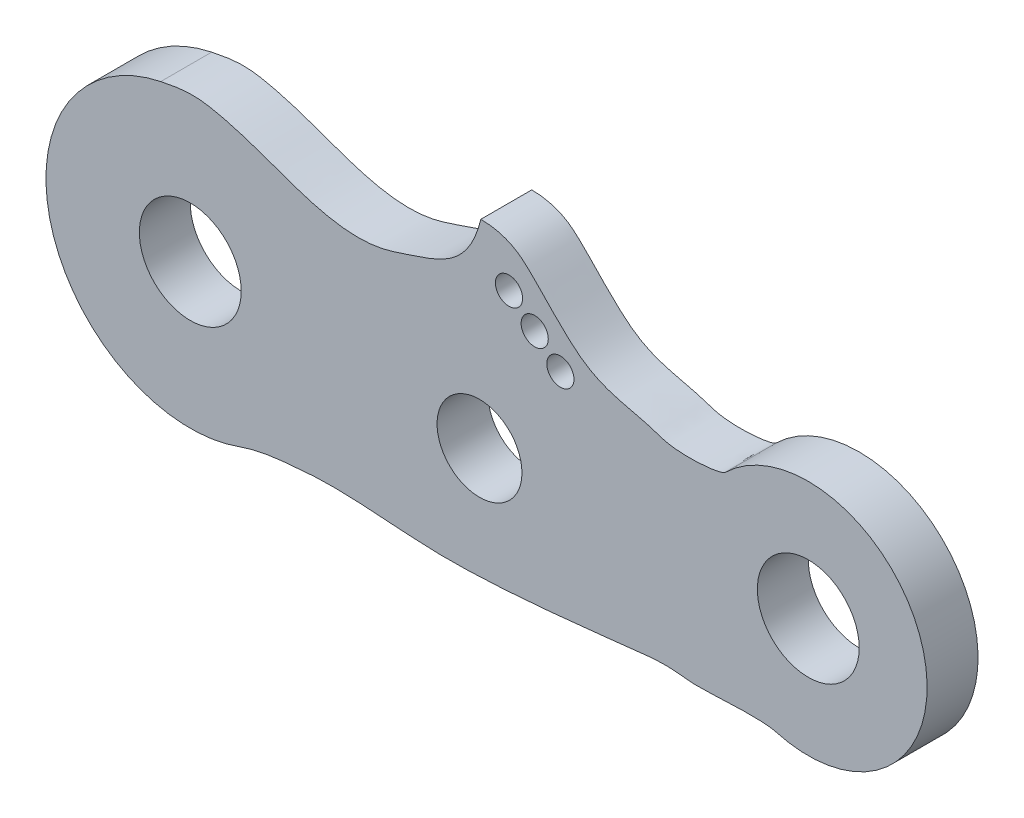
ISO-10303-21;
HEADER;
FILE_DESCRIPTION(('STEP AP214'),'2;1');
FILE_NAME('part.step','',(''),(''),'','','');
FILE_SCHEMA(('AUTOMOTIVE_DESIGN { 1 0 10303 214 1 1 1 1 }'));
ENDSEC;
DATA;
#1=APPLICATION_CONTEXT('core data for automotive mechanical design processes');
#2=APPLICATION_PROTOCOL_DEFINITION('international standard','automotive_design',2000,#1);
#3=PRODUCT_CONTEXT('',#1,'mechanical');
#4=PRODUCT('Part','Part','',(#3));
#5=PRODUCT_RELATED_PRODUCT_CATEGORY('part','',(#4));
#6=PRODUCT_DEFINITION_FORMATION('','',#4);
#7=PRODUCT_DEFINITION_CONTEXT('part definition',#1,'design');
#8=PRODUCT_DEFINITION('design','',#6,#7);
#9=PRODUCT_DEFINITION_SHAPE('','',#8);
#10=(LENGTH_UNIT() NAMED_UNIT(*) SI_UNIT(.MILLI.,.METRE.));
#11=(NAMED_UNIT(*) PLANE_ANGLE_UNIT() SI_UNIT($,.RADIAN.));
#12=(NAMED_UNIT(*) SI_UNIT($,.STERADIAN.) SOLID_ANGLE_UNIT());
#13=UNCERTAINTY_MEASURE_WITH_UNIT(LENGTH_MEASURE(1.E-05),#10,'distance_accuracy_value','');
#14=(GEOMETRIC_REPRESENTATION_CONTEXT(3) GLOBAL_UNCERTAINTY_ASSIGNED_CONTEXT((#13)) GLOBAL_UNIT_ASSIGNED_CONTEXT((#10,
#11,#12)) REPRESENTATION_CONTEXT('',''));
#15=CARTESIAN_POINT('',(0.,0.,0.));
#16=DIRECTION('',(0.,0.,1.));
#17=DIRECTION('',(1.,0.,0.));
#18=AXIS2_PLACEMENT_3D('',#15,#16,#17);
#19=CARTESIAN_POINT('',(85.5767290134854,53.6154900685071,15.));
#20=CARTESIAN_POINT('',(89.9510996369342,53.5978265476081,15.));
#21=CARTESIAN_POINT('',(95.0659658712574,51.9583798848896,15.));
#22=CARTESIAN_POINT('',(103.617048541914,44.4315361567687,15.));
#23=CARTESIAN_POINT('',(117.031089923121,27.9519192309751,15.));
#24=CARTESIAN_POINT('',(131.204676748388,27.3587503118321,15.));
#25=CARTESIAN_POINT('',(143.43335666953,22.7090794433779,15.));
#26=CARTESIAN_POINT('',(156.177574777557,23.7084113234692,15.));
#27=CARTESIAN_POINT('',(157.590408339707,25.0832979286572,15.));
#28=B_SPLINE_CURVE_WITH_KNOTS('',3,(#19,#20,#21,#22,#23,#24,#25,#26,#27),.UNSPECIFIED.,.F.,.F.,
(4,1,1,1,1,1,4),(0.,0.133860120087567,0.179539567212329,0.456794471247624,0.762138658239129,
0.816459211114367,1.),.UNSPECIFIED.);
#29=DIRECTION('',(0.,0.,-1.));
#30=VECTOR('',#29,1.);
#31=SURFACE_OF_LINEAR_EXTRUSION('',#28,#30);
#32=CARTESIAN_POINT('',(85.5767290134854,53.6154900685071,0.));
#33=CARTESIAN_POINT('',(89.9510996369342,53.5978265476081,0.));
#34=CARTESIAN_POINT('',(95.0659658712574,51.9583798848896,0.));
#35=CARTESIAN_POINT('',(103.617048541914,44.4315361567687,0.));
#36=CARTESIAN_POINT('',(117.031089923121,27.9519192309751,0.));
#37=CARTESIAN_POINT('',(131.204676748388,27.3587503118321,0.));
#38=CARTESIAN_POINT('',(143.43335666953,22.7090794433779,0.));
#39=CARTESIAN_POINT('',(156.177574777557,23.7084113234692,0.));
#40=CARTESIAN_POINT('',(157.590408339707,25.0832979286572,0.));
#41=B_SPLINE_CURVE_WITH_KNOTS('',3,(#32,#33,#34,#35,#36,#37,#38,#39,#40),.UNSPECIFIED.,.F.,.F.,
(4,1,1,1,1,1,4),(0.,0.133860120087567,0.179539567212329,0.456794471247624,0.762138658239129,
0.816459211114367,1.),.UNSPECIFIED.);
#42=CARTESIAN_POINT('',(85.5767290134854,53.6154900685071,0.));
#43=VERTEX_POINT('',#42);
#44=CARTESIAN_POINT('',(157.590408339707,25.0832979286571,0.));
#45=VERTEX_POINT('',#44);
#46=EDGE_CURVE('E155',#43,#45,#41,.T.);
#47=ORIENTED_EDGE('',*,*,#46,.F.);
#48=DIRECTION('',(0.,0.,-1.));
#49=VECTOR('',#48,1.);
#50=CARTESIAN_POINT('',(85.5767290134854,53.6154900685071,15.));
#51=LINE('',#50,#49);
#52=CARTESIAN_POINT('',(85.5767290134854,53.6154900685071,15.));
#53=VERTEX_POINT('',#52);
#54=EDGE_CURVE('E11',#53,#43,#51,.T.);
#55=ORIENTED_EDGE('',*,*,#54,.F.);
#56=CARTESIAN_POINT('',(157.590408339707,25.0832979286571,15.));
#57=VERTEX_POINT('',#56);
#58=EDGE_CURVE('E215',#53,#57,#28,.T.);
#59=ORIENTED_EDGE('',*,*,#58,.T.);
#60=DIRECTION('',(0.,0.,-1.));
#61=VECTOR('',#60,1.);
#62=CARTESIAN_POINT('',(157.590408339707,25.0832979286571,15.));
#63=LINE('',#62,#61);
#64=EDGE_CURVE('E90',#57,#45,#63,.T.);
#65=ORIENTED_EDGE('',*,*,#64,.T.);
#66=EDGE_LOOP('',(#47,#55,#59,#65));
#67=FACE_BOUND('',#66,.T.);
#68=ADVANCED_FACE('F47',(#67),#31,.T.);
#69=CARTESIAN_POINT('',(-8.69238390109521,41.6015920622755,15.));
#70=CARTESIAN_POINT('',(-2.6494188525056,42.8642305695857,15.));
#71=CARTESIAN_POINT('',(1.65449090577422,43.2803095961558,15.));
#72=CARTESIAN_POINT('',(17.7059986411609,39.7891746645451,15.));
#73=CARTESIAN_POINT('',(32.6779917285641,32.9043733055839,15.));
#74=CARTESIAN_POINT('',(51.2364803374627,29.5015101114778,15.));
#75=CARTESIAN_POINT('',(71.8518040546991,36.5493674583681,15.));
#76=CARTESIAN_POINT('',(82.0421987183313,39.1312138465181,15.));
#77=CARTESIAN_POINT('',(85.5767290134854,53.6154900685071,15.));
#78=B_SPLINE_CURVE_WITH_KNOTS('',3,(#69,#70,#71,#72,#73,#74,#75,#76,#77),.UNSPECIFIED.,.F.,.F.,
(4,1,1,1,1,1,4),(0.,0.135925503940728,0.178703955383284,0.427784514425553,0.654064451904136,
0.711286000461581,1.),.UNSPECIFIED.);
#79=DIRECTION('',(0.,0.,-1.));
#80=VECTOR('',#79,1.);
#81=SURFACE_OF_LINEAR_EXTRUSION('',#78,#80);
#82=CARTESIAN_POINT('',(-8.69238390109521,41.6015920622755,0.));
#83=CARTESIAN_POINT('',(-2.6494188525056,42.8642305695857,0.));
#84=CARTESIAN_POINT('',(1.65449090577422,43.2803095961558,0.));
#85=CARTESIAN_POINT('',(17.7059986411609,39.7891746645451,0.));
#86=CARTESIAN_POINT('',(32.6779917285641,32.9043733055839,0.));
#87=CARTESIAN_POINT('',(51.2364803374627,29.5015101114778,0.));
#88=CARTESIAN_POINT('',(71.8518040546991,36.5493674583681,0.));
#89=CARTESIAN_POINT('',(82.0421987183313,39.1312138465181,0.));
#90=CARTESIAN_POINT('',(85.5767290134854,53.6154900685071,0.));
#91=B_SPLINE_CURVE_WITH_KNOTS('',3,(#82,#83,#84,#85,#86,#87,#88,#89,#90),.UNSPECIFIED.,.F.,.F.,
(4,1,1,1,1,1,4),(0.,0.135925503940728,0.178703955383284,0.427784514425553,0.654064451904136,
0.711286000461581,1.),.UNSPECIFIED.);
#92=CARTESIAN_POINT('',(-8.69238390109521,41.6015920622755,0.));
#93=VERTEX_POINT('',#92);
#94=EDGE_CURVE('E149',#93,#43,#91,.T.);
#95=ORIENTED_EDGE('',*,*,#94,.F.);
#96=DIRECTION('',(0.,0.,-1.));
#97=VECTOR('',#96,1.);
#98=CARTESIAN_POINT('',(-8.69238390109521,41.6015920622755,15.));
#99=LINE('',#98,#97);
#100=CARTESIAN_POINT('',(-8.69238390109521,41.6015920622755,15.));
#101=VERTEX_POINT('',#100);
#102=EDGE_CURVE('E57',#101,#93,#99,.T.);
#103=ORIENTED_EDGE('',*,*,#102,.F.);
#104=EDGE_CURVE('E116',#101,#53,#78,.T.);
#105=ORIENTED_EDGE('',*,*,#104,.T.);
#106=ORIENTED_EDGE('',*,*,#54,.T.);
#107=EDGE_LOOP('',(#95,#103,#105,#106));
#108=FACE_BOUND('',#107,.T.);
#109=ADVANCED_FACE('F205',(#108),#81,.T.);
#110=CARTESIAN_POINT('',(0.,0.,15.));
#111=DIRECTION('',(0.,0.,-1.));
#112=DIRECTION('',(-1.,0.,0.));
#113=AXIS2_PLACEMENT_3D('',#110,#111,#112);
#114=CYLINDRICAL_SURFACE('',#113,42.5);
#115=CARTESIAN_POINT('',(0.,0.,0.));
#116=DIRECTION('',(0.,0.,1.));
#117=DIRECTION('',(1.,0.,0.));
#118=AXIS2_PLACEMENT_3D('',#115,#116,#117);
#119=CIRCLE('',#118,42.5);
#120=CARTESIAN_POINT('',(14.453121838912,-39.9669522119158,0.));
#121=VERTEX_POINT('',#120);
#122=EDGE_CURVE('E122',#93,#121,#119,.T.);
#123=ORIENTED_EDGE('',*,*,#122,.T.);
#124=DIRECTION('',(0.,0.,-1.));
#125=VECTOR('',#124,1.);
#126=CARTESIAN_POINT('',(14.453121838912,-39.9669522119158,15.));
#127=LINE('',#126,#125);
#128=CARTESIAN_POINT('',(14.453121838912,-39.9669522119158,15.));
#129=VERTEX_POINT('',#128);
#130=EDGE_CURVE('E105',#129,#121,#127,.T.);
#131=ORIENTED_EDGE('',*,*,#130,.F.);
#132=CARTESIAN_POINT('',(0.,0.,15.));
#133=DIRECTION('',(0.,0.,1.));
#134=DIRECTION('',(1.,0.,0.));
#135=AXIS2_PLACEMENT_3D('',#132,#133,#134);
#136=CIRCLE('',#135,42.5);
#137=EDGE_CURVE('E109',#101,#129,#136,.T.);
#138=ORIENTED_EDGE('',*,*,#137,.F.);
#139=ORIENTED_EDGE('',*,*,#102,.T.);
#140=EDGE_LOOP('',(#123,#131,#138,#139));
#141=FACE_BOUND('',#140,.T.);
#142=ADVANCED_FACE('F120',(#141),#114,.T.);
#143=CARTESIAN_POINT('',(14.453121838912,-39.9669522119158,15.));
#144=CARTESIAN_POINT('',(20.3241830925875,-37.843818999927,15.));
#145=CARTESIAN_POINT('',(27.7277641906688,-37.2150369766777,15.));
#146=CARTESIAN_POINT('',(43.472623732249,-35.8338372264779,15.));
#147=CARTESIAN_POINT('',(58.3976024545707,-37.2763707614494,15.));
#148=CARTESIAN_POINT('',(84.9463150162876,-38.5832453042967,15.));
#149=CARTESIAN_POINT('',(114.704531254197,-35.5222210349262,15.));
#150=CARTESIAN_POINT('',(142.355688015475,-32.171380422443,15.));
#151=CARTESIAN_POINT('',(144.567405537628,-33.6899591737131,15.));
#152=CARTESIAN_POINT('',(153.929721623876,-33.4753561972203,15.));
#153=CARTESIAN_POINT('',(168.590787669413,-32.5979777698916,15.));
#154=CARTESIAN_POINT('',(172.613360968013,-33.7178143965944,15.));
#155=B_SPLINE_CURVE_WITH_KNOTS('',3,(#143,#144,#145,#146,#147,#148,#149,#150,#151,#152,#153,
#154),.UNSPECIFIED.,.F.,.F.,(4,1,1,1,1,1,1,1,1,4),(0.,0.11255920978683,0.148246657854316,
0.333693611472572,0.392620141225125,0.678585425627291,0.734324884616535,0.894275272128318,
0.922842163510562,1.),.UNSPECIFIED.);
#156=DIRECTION('',(0.,0.,-1.));
#157=VECTOR('',#156,1.);
#158=SURFACE_OF_LINEAR_EXTRUSION('',#155,#157);
#159=CARTESIAN_POINT('',(14.453121838912,-39.9669522119158,0.));
#160=CARTESIAN_POINT('',(20.3241830925875,-37.843818999927,0.));
#161=CARTESIAN_POINT('',(27.7277641906688,-37.2150369766777,0.));
#162=CARTESIAN_POINT('',(43.472623732249,-35.8338372264779,0.));
#163=CARTESIAN_POINT('',(58.3976024545707,-37.2763707614494,0.));
#164=CARTESIAN_POINT('',(84.9463150162876,-38.5832453042967,0.));
#165=CARTESIAN_POINT('',(114.704531254197,-35.5222210349262,0.));
#166=CARTESIAN_POINT('',(142.355688015475,-32.171380422443,0.));
#167=CARTESIAN_POINT('',(144.567405537628,-33.6899591737131,0.));
#168=CARTESIAN_POINT('',(153.929721623876,-33.4753561972203,0.));
#169=CARTESIAN_POINT('',(168.590787669413,-32.5979777698916,0.));
#170=CARTESIAN_POINT('',(172.613360968013,-33.7178143965944,0.));
#171=B_SPLINE_CURVE_WITH_KNOTS('',3,(#159,#160,#161,#162,#163,#164,#165,#166,#167,#168,#169,
#170),.UNSPECIFIED.,.F.,.F.,(4,1,1,1,1,1,1,1,1,4),(0.,0.11255920978683,0.148246657854316,
0.333693611472572,0.392620141225125,0.678585425627291,0.734324884616535,0.894275272128318,
0.922842163510562,1.),.UNSPECIFIED.);
#172=CARTESIAN_POINT('',(172.613360968013,-33.7178143965944,0.));
#173=VERTEX_POINT('',#172);
#174=EDGE_CURVE('E139',#121,#173,#171,.T.);
#175=ORIENTED_EDGE('',*,*,#174,.T.);
#176=DIRECTION('',(0.,0.,-1.));
#177=VECTOR('',#176,1.);
#178=CARTESIAN_POINT('',(172.613360968013,-33.7178143965944,15.));
#179=LINE('',#178,#177);
#180=CARTESIAN_POINT('',(172.613360968013,-33.7178143965944,15.));
#181=VERTEX_POINT('',#180);
#182=EDGE_CURVE('E107',#181,#173,#179,.T.);
#183=ORIENTED_EDGE('',*,*,#182,.F.);
#184=EDGE_CURVE('E100',#129,#181,#155,.T.);
#185=ORIENTED_EDGE('',*,*,#184,.F.);
#186=ORIENTED_EDGE('',*,*,#130,.T.);
#187=EDGE_LOOP('',(#175,#183,#185,#186));
#188=FACE_BOUND('',#187,.T.);
#189=ADVANCED_FACE('F103',(#188),#158,.F.);
#190=CARTESIAN_POINT('',(182.,0.,15.));
#191=DIRECTION('',(0.,0.,-1.));
#192=DIRECTION('',(-1.,0.,0.));
#193=AXIS2_PLACEMENT_3D('',#190,#191,#192);
#194=CYLINDRICAL_SURFACE('',#193,35.);
#195=CARTESIAN_POINT('',(182.,0.,0.));
#196=DIRECTION('',(0.,0.,1.));
#197=DIRECTION('',(1.,0.,0.));
#198=AXIS2_PLACEMENT_3D('',#195,#196,#197);
#199=CIRCLE('',#198,35.);
#200=EDGE_CURVE('E83',#173,#45,#199,.T.);
#201=ORIENTED_EDGE('',*,*,#200,.T.);
#202=ORIENTED_EDGE('',*,*,#64,.F.);
#203=CARTESIAN_POINT('',(182.,0.,15.));
#204=DIRECTION('',(0.,0.,1.));
#205=DIRECTION('',(1.,0.,0.));
#206=AXIS2_PLACEMENT_3D('',#203,#204,#205);
#207=CIRCLE('',#206,35.);
#208=EDGE_CURVE('E65',#181,#57,#207,.T.);
#209=ORIENTED_EDGE('',*,*,#208,.F.);
#210=ORIENTED_EDGE('',*,*,#182,.T.);
#211=EDGE_LOOP('',(#201,#202,#209,#210));
#212=FACE_BOUND('',#211,.T.);
#213=ADVANCED_FACE('F201',(#212),#194,.T.);
#214=CARTESIAN_POINT('',(85.1809765951115,-5.,15.));
#215=DIRECTION('',(0.,0.,-1.));
#216=DIRECTION('',(-1.,0.,0.));
#217=AXIS2_PLACEMENT_3D('',#214,#215,#216);
#218=CYLINDRICAL_SURFACE('',#217,12.5);
#219=CARTESIAN_POINT('',(85.1809765951115,-5.,15.));
#220=DIRECTION('',(0.,0.,1.));
#221=DIRECTION('',(1.,0.,0.));
#222=AXIS2_PLACEMENT_3D('',#219,#220,#221);
#223=CIRCLE('',#222,12.5);
#224=CARTESIAN_POINT('',(97.6809765951115,-5.,15.));
#225=VERTEX_POINT('',#224);
#226=EDGE_CURVE('E224',#225,#225,#223,.T.);
#227=ORIENTED_EDGE('',*,*,#226,.T.);
#228=EDGE_LOOP('',(#227));
#229=FACE_BOUND('',#228,.T.);
#230=CARTESIAN_POINT('',(85.1809765951115,-5.,0.));
#231=DIRECTION('',(0.,0.,1.));
#232=DIRECTION('',(1.,0.,0.));
#233=AXIS2_PLACEMENT_3D('',#230,#231,#232);
#234=CIRCLE('',#233,12.5);
#235=CARTESIAN_POINT('',(97.6809765951115,-5.,0.));
#236=VERTEX_POINT('',#235);
#237=EDGE_CURVE('E163',#236,#236,#234,.T.);
#238=ORIENTED_EDGE('',*,*,#237,.F.);
#239=EDGE_LOOP('',(#238));
#240=FACE_BOUND('',#239,.T.);
#241=ADVANCED_FACE('F262',(#229,#240),#218,.F.);
#242=CARTESIAN_POINT('',(182.,0.,15.));
#243=DIRECTION('',(0.,0.,-1.));
#244=DIRECTION('',(-1.,0.,0.));
#245=AXIS2_PLACEMENT_3D('',#242,#243,#244);
#246=CYLINDRICAL_SURFACE('',#245,15.);
#247=CARTESIAN_POINT('',(182.,0.,15.));
#248=DIRECTION('',(0.,0.,1.));
#249=DIRECTION('',(1.,0.,0.));
#250=AXIS2_PLACEMENT_3D('',#247,#248,#249);
#251=CIRCLE('',#250,15.);
#252=CARTESIAN_POINT('',(197.,0.,15.));
#253=VERTEX_POINT('',#252);
#254=EDGE_CURVE('E231',#253,#253,#251,.T.);
#255=ORIENTED_EDGE('',*,*,#254,.T.);
#256=EDGE_LOOP('',(#255));
#257=FACE_BOUND('',#256,.T.);
#258=CARTESIAN_POINT('',(182.,0.,0.));
#259=DIRECTION('',(0.,0.,1.));
#260=DIRECTION('',(1.,0.,0.));
#261=AXIS2_PLACEMENT_3D('',#258,#259,#260);
#262=CIRCLE('',#261,15.);
#263=CARTESIAN_POINT('',(197.,0.,0.));
#264=VERTEX_POINT('',#263);
#265=EDGE_CURVE('E170',#264,#264,#262,.T.);
#266=ORIENTED_EDGE('',*,*,#265,.F.);
#267=EDGE_LOOP('',(#266));
#268=FACE_BOUND('',#267,.T.);
#269=ADVANCED_FACE('F265',(#257,#268),#246,.F.);
#270=CARTESIAN_POINT('',(93.8633575034312,39.547847307204,15.));
#271=DIRECTION('',(0.,0.,-1.));
#272=DIRECTION('',(-1.,0.,0.));
#273=AXIS2_PLACEMENT_3D('',#270,#271,#272);
#274=CYLINDRICAL_SURFACE('',#273,4.00000000000001);
#275=CARTESIAN_POINT('',(93.8633575034312,39.547847307204,15.));
#276=DIRECTION('',(0.,0.,1.));
#277=DIRECTION('',(1.,0.,0.));
#278=AXIS2_PLACEMENT_3D('',#275,#276,#277);
#279=CIRCLE('',#278,4.00000000000001);
#280=CARTESIAN_POINT('',(97.8633575034312,39.547847307204,15.));
#281=VERTEX_POINT('',#280);
#282=EDGE_CURVE('E235',#281,#281,#279,.T.);
#283=ORIENTED_EDGE('',*,*,#282,.T.);
#284=EDGE_LOOP('',(#283));
#285=FACE_BOUND('',#284,.T.);
#286=CARTESIAN_POINT('',(93.8633575034312,39.547847307204,0.));
#287=DIRECTION('',(0.,0.,1.));
#288=DIRECTION('',(1.,0.,0.));
#289=AXIS2_PLACEMENT_3D('',#286,#287,#288);
#290=CIRCLE('',#289,4.00000000000001);
#291=CARTESIAN_POINT('',(97.8633575034312,39.547847307204,0.));
#292=VERTEX_POINT('',#291);
#293=EDGE_CURVE('E174',#292,#292,#290,.T.);
#294=ORIENTED_EDGE('',*,*,#293,.F.);
#295=EDGE_LOOP('',(#294));
#296=FACE_BOUND('',#295,.T.);
#297=ADVANCED_FACE('F318',(#285,#296),#274,.F.);
#298=CARTESIAN_POINT('',(101.433042145182,33.0133332147526,15.));
#299=DIRECTION('',(0.,0.,-1.));
#300=DIRECTION('',(-1.,0.,0.));
#301=AXIS2_PLACEMENT_3D('',#298,#299,#300);
#302=CYLINDRICAL_SURFACE('',#301,4.00000000000001);
#303=CARTESIAN_POINT('',(101.433042145182,33.0133332147526,15.));
#304=DIRECTION('',(0.,0.,1.));
#305=DIRECTION('',(1.,0.,0.));
#306=AXIS2_PLACEMENT_3D('',#303,#304,#305);
#307=CIRCLE('',#306,4.00000000000001);
#308=CARTESIAN_POINT('',(105.433042145182,33.0133332147526,15.));
#309=VERTEX_POINT('',#308);
#310=EDGE_CURVE('E239',#309,#309,#307,.T.);
#311=ORIENTED_EDGE('',*,*,#310,.T.);
#312=EDGE_LOOP('',(#311));
#313=FACE_BOUND('',#312,.T.);
#314=CARTESIAN_POINT('',(101.433042145182,33.0133332147526,0.));
#315=DIRECTION('',(0.,0.,1.));
#316=DIRECTION('',(1.,0.,0.));
#317=AXIS2_PLACEMENT_3D('',#314,#315,#316);
#318=CIRCLE('',#317,4.00000000000001);
#319=CARTESIAN_POINT('',(105.433042145182,33.0133332147526,0.));
#320=VERTEX_POINT('',#319);
#321=EDGE_CURVE('E178',#320,#320,#318,.T.);
#322=ORIENTED_EDGE('',*,*,#321,.F.);
#323=EDGE_LOOP('',(#322));
#324=FACE_BOUND('',#323,.T.);
#325=ADVANCED_FACE('F279',(#313,#324),#302,.F.);
#326=CARTESIAN_POINT('',(109.002726786932,26.4788191223013,15.));
#327=DIRECTION('',(0.,0.,-1.));
#328=DIRECTION('',(-1.,0.,0.));
#329=AXIS2_PLACEMENT_3D('',#326,#327,#328);
#330=CYLINDRICAL_SURFACE('',#329,4.00000000000001);
#331=CARTESIAN_POINT('',(109.002726786932,26.4788191223013,15.));
#332=DIRECTION('',(0.,0.,1.));
#333=DIRECTION('',(1.,0.,0.));
#334=AXIS2_PLACEMENT_3D('',#331,#332,#333);
#335=CIRCLE('',#334,4.00000000000001);
#336=CARTESIAN_POINT('',(113.002726786932,26.4788191223013,15.));
#337=VERTEX_POINT('',#336);
#338=EDGE_CURVE('E136',#337,#337,#335,.T.);
#339=ORIENTED_EDGE('',*,*,#338,.T.);
#340=EDGE_LOOP('',(#339));
#341=FACE_BOUND('',#340,.T.);
#342=CARTESIAN_POINT('',(109.002726786932,26.4788191223013,0.));
#343=DIRECTION('',(0.,0.,1.));
#344=DIRECTION('',(1.,0.,0.));
#345=AXIS2_PLACEMENT_3D('',#342,#343,#344);
#346=CIRCLE('',#345,4.00000000000001);
#347=CARTESIAN_POINT('',(113.002726786932,26.4788191223013,0.));
#348=VERTEX_POINT('',#347);
#349=EDGE_CURVE('E182',#348,#348,#346,.T.);
#350=ORIENTED_EDGE('',*,*,#349,.F.);
#351=EDGE_LOOP('',(#350));
#352=FACE_BOUND('',#351,.T.);
#353=ADVANCED_FACE('F49',(#341,#352),#330,.F.);
#354=CARTESIAN_POINT('',(0.,0.,15.));
#355=DIRECTION('',(0.,0.,-1.));
#356=DIRECTION('',(-1.,0.,0.));
#357=AXIS2_PLACEMENT_3D('',#354,#355,#356);
#358=CYLINDRICAL_SURFACE('',#357,15.);
#359=CARTESIAN_POINT('',(0.,0.,15.));
#360=DIRECTION('',(0.,0.,1.));
#361=DIRECTION('',(1.,0.,0.));
#362=AXIS2_PLACEMENT_3D('',#359,#360,#361);
#363=CIRCLE('',#362,15.);
#364=CARTESIAN_POINT('',(15.,0.,15.));
#365=VERTEX_POINT('',#364);
#366=EDGE_CURVE('E131',#365,#365,#363,.T.);
#367=ORIENTED_EDGE('',*,*,#366,.T.);
#368=EDGE_LOOP('',(#367));
#369=FACE_BOUND('',#368,.T.);
#370=CARTESIAN_POINT('',(0.,0.,0.));
#371=DIRECTION('',(0.,0.,1.));
#372=DIRECTION('',(1.,0.,0.));
#373=AXIS2_PLACEMENT_3D('',#370,#371,#372);
#374=CIRCLE('',#373,15.);
#375=CARTESIAN_POINT('',(15.,0.,0.));
#376=VERTEX_POINT('',#375);
#377=EDGE_CURVE('E132',#376,#376,#374,.T.);
#378=ORIENTED_EDGE('',*,*,#377,.F.);
#379=EDGE_LOOP('',(#378));
#380=FACE_BOUND('',#379,.T.);
#381=ADVANCED_FACE('F252',(#369,#380),#358,.F.);
#382=CARTESIAN_POINT('',(0.,0.,15.));
#383=DIRECTION('',(0.,0.,1.));
#384=DIRECTION('',(1.,0.,0.));
#385=AXIS2_PLACEMENT_3D('',#382,#383,#384);
#386=PLANE('',#385);
#387=ORIENTED_EDGE('',*,*,#338,.F.);
#388=EDGE_LOOP('',(#387));
#389=FACE_BOUND('',#388,.T.);
#390=ORIENTED_EDGE('',*,*,#310,.F.);
#391=EDGE_LOOP('',(#390));
#392=FACE_BOUND('',#391,.T.);
#393=ORIENTED_EDGE('',*,*,#282,.F.);
#394=EDGE_LOOP('',(#393));
#395=FACE_BOUND('',#394,.T.);
#396=ORIENTED_EDGE('',*,*,#254,.F.);
#397=EDGE_LOOP('',(#396));
#398=FACE_BOUND('',#397,.T.);
#399=ORIENTED_EDGE('',*,*,#226,.F.);
#400=EDGE_LOOP('',(#399));
#401=FACE_BOUND('',#400,.T.);
#402=ORIENTED_EDGE('',*,*,#58,.F.);
#403=ORIENTED_EDGE('',*,*,#104,.F.);
#404=ORIENTED_EDGE('',*,*,#137,.T.);
#405=ORIENTED_EDGE('',*,*,#184,.T.);
#406=ORIENTED_EDGE('',*,*,#208,.T.);
#407=EDGE_LOOP('',(#402,#403,#404,#405,#406));
#408=FACE_BOUND('',#407,.T.);
#409=ORIENTED_EDGE('',*,*,#366,.F.);
#410=EDGE_LOOP('',(#409));
#411=FACE_BOUND('',#410,.T.);
#412=ADVANCED_FACE('F113',(#389,#392,#395,#398,#401,#408,#411),#386,.T.);
#413=CARTESIAN_POINT('',(0.,0.,0.));
#414=DIRECTION('',(0.,0.,1.));
#415=DIRECTION('',(1.,0.,0.));
#416=AXIS2_PLACEMENT_3D('',#413,#414,#415);
#417=PLANE('',#416);
#418=ORIENTED_EDGE('',*,*,#349,.T.);
#419=EDGE_LOOP('',(#418));
#420=FACE_BOUND('',#419,.T.);
#421=ORIENTED_EDGE('',*,*,#321,.T.);
#422=EDGE_LOOP('',(#421));
#423=FACE_BOUND('',#422,.T.);
#424=ORIENTED_EDGE('',*,*,#293,.T.);
#425=EDGE_LOOP('',(#424));
#426=FACE_BOUND('',#425,.T.);
#427=ORIENTED_EDGE('',*,*,#265,.T.);
#428=EDGE_LOOP('',(#427));
#429=FACE_BOUND('',#428,.T.);
#430=ORIENTED_EDGE('',*,*,#237,.T.);
#431=EDGE_LOOP('',(#430));
#432=FACE_BOUND('',#431,.T.);
#433=ORIENTED_EDGE('',*,*,#46,.T.);
#434=ORIENTED_EDGE('',*,*,#200,.F.);
#435=ORIENTED_EDGE('',*,*,#174,.F.);
#436=ORIENTED_EDGE('',*,*,#122,.F.);
#437=ORIENTED_EDGE('',*,*,#94,.T.);
#438=EDGE_LOOP('',(#433,#434,#435,#436,#437));
#439=FACE_BOUND('',#438,.T.);
#440=ORIENTED_EDGE('',*,*,#377,.T.);
#441=EDGE_LOOP('',(#440));
#442=FACE_BOUND('',#441,.T.);
#443=ADVANCED_FACE('F251',(#420,#423,#426,#429,#432,#439,#442),#417,.F.);
#444=CLOSED_SHELL('',(#68,#109,#142,#189,#213,#241,#269,#297,#325,#353,#381,#412,#443));
#445=MANIFOLD_SOLID_BREP('B2',#444);
#446=ADVANCED_BREP_SHAPE_REPRESENTATION('',(#18,#445),#14);
#447=SHAPE_DEFINITION_REPRESENTATION(#9,#446);
ENDSEC;
END-ISO-10303-21;
